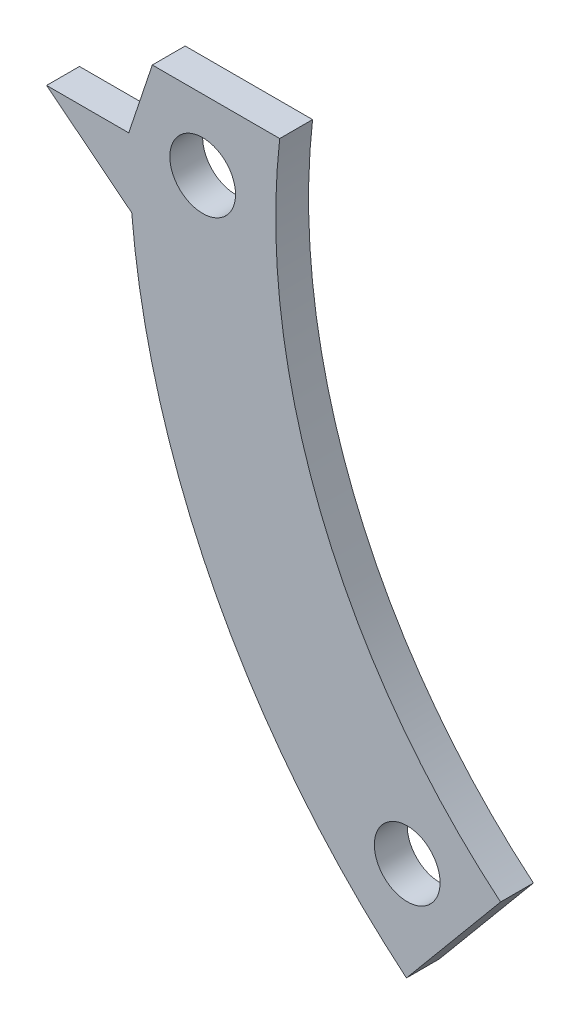
ISO-10303-21;
HEADER;
FILE_DESCRIPTION(('STEP AP214'),'2;1');
FILE_NAME('part.step','',(''),(''),'','','');
FILE_SCHEMA(('AUTOMOTIVE_DESIGN { 1 0 10303 214 1 1 1 1 }'));
ENDSEC;
DATA;
#1=APPLICATION_CONTEXT('core data for automotive mechanical design processes');
#2=APPLICATION_PROTOCOL_DEFINITION('international standard','automotive_design',2000,#1);
#3=PRODUCT_CONTEXT('',#1,'mechanical');
#4=PRODUCT('Part','Part','',(#3));
#5=PRODUCT_RELATED_PRODUCT_CATEGORY('part','',(#4));
#6=PRODUCT_DEFINITION_FORMATION('','',#4);
#7=PRODUCT_DEFINITION_CONTEXT('part definition',#1,'design');
#8=PRODUCT_DEFINITION('design','',#6,#7);
#9=PRODUCT_DEFINITION_SHAPE('','',#8);
#10=(LENGTH_UNIT() NAMED_UNIT(*) SI_UNIT(.MILLI.,.METRE.));
#11=(NAMED_UNIT(*) PLANE_ANGLE_UNIT() SI_UNIT($,.RADIAN.));
#12=(NAMED_UNIT(*) SI_UNIT($,.STERADIAN.) SOLID_ANGLE_UNIT());
#13=UNCERTAINTY_MEASURE_WITH_UNIT(LENGTH_MEASURE(1.E-05),#10,'distance_accuracy_value','');
#14=(GEOMETRIC_REPRESENTATION_CONTEXT(3) GLOBAL_UNCERTAINTY_ASSIGNED_CONTEXT((#13)) GLOBAL_UNIT_ASSIGNED_CONTEXT((#10,
#11,#12)) REPRESENTATION_CONTEXT('',''));
#15=CARTESIAN_POINT('',(0.,0.,0.));
#16=DIRECTION('',(0.,0.,1.));
#17=DIRECTION('',(1.,0.,0.));
#18=AXIS2_PLACEMENT_3D('',#15,#16,#17);
#19=CARTESIAN_POINT('',(0.,53.009783314729,2.));
#20=DIRECTION('',(0.,0.,1.));
#21=DIRECTION('',(1.,0.,0.));
#22=AXIS2_PLACEMENT_3D('',#19,#20,#21);
#23=PLANE('',#22);
#24=CARTESIAN_POINT('',(-30.0520382004283,22.9577451143008,2.));
#25=DIRECTION('',(0.,0.,1.));
#26=DIRECTION('',(1.,0.,0.));
#27=AXIS2_PLACEMENT_3D('',#24,#25,#26);
#28=CIRCLE('',#27,2.);
#29=CARTESIAN_POINT('',(-28.0520382004283,22.9577451143008,2.));
#30=VERTEX_POINT('',#29);
#31=EDGE_CURVE('E128',#30,#30,#28,.T.);
#32=ORIENTED_EDGE('',*,*,#31,.F.);
#33=EDGE_LOOP('',(#32));
#34=FACE_BOUND('',#33,.T.);
#35=CARTESIAN_POINT('',(0.,53.009783314729,2.));
#36=DIRECTION('',(0.,0.,-1.));
#37=DIRECTION('',(1.,0.,0.));
#38=AXIS2_PLACEMENT_3D('',#35,#36,#37);
#39=CIRCLE('',#38,38.0547924587685);
#40=CARTESIAN_POINT('',(-24.3706790032404,23.7824462139777,2.));
#41=VERTEX_POINT('',#40);
#42=CARTESIAN_POINT('',(-37.8116954402825,57.3043050589126,2.));
#43=VERTEX_POINT('',#42);
#44=EDGE_CURVE('E137',#41,#43,#39,.T.);
#45=ORIENTED_EDGE('',*,*,#44,.T.);
#46=DIRECTION('',(-1.,0.,0.));
#47=VECTOR('',#46,1.);
#48=CARTESIAN_POINT('',(-37.8116954402825,57.3043050589126,2.));
#49=LINE('',#48,#47);
#50=CARTESIAN_POINT('',(-45.5658100455985,57.3043050589128,2.));
#51=VERTEX_POINT('',#50);
#52=EDGE_CURVE('E90',#43,#51,#49,.T.);
#53=ORIENTED_EDGE('',*,*,#52,.T.);
#54=DIRECTION('',(-0.316760978067004,-0.948505394172345,0.));
#55=VECTOR('',#54,1.);
#56=CARTESIAN_POINT('',(-45.5658100455985,57.3043050589128,2.));
#57=LINE('',#56,#55);
#58=CARTESIAN_POINT('',(-47.,53.009783314729,2.));
#59=VERTEX_POINT('',#58);
#60=EDGE_CURVE('E149',#51,#59,#57,.T.);
#61=ORIENTED_EDGE('',*,*,#60,.T.);
#62=DIRECTION('',(-1.,0.,0.));
#63=VECTOR('',#62,1.);
#64=CARTESIAN_POINT('',(-47.,53.009783314729,2.));
#65=LINE('',#64,#63);
#66=CARTESIAN_POINT('',(-52.,53.0097833147292,2.));
#67=VERTEX_POINT('',#66);
#68=EDGE_CURVE('E106',#59,#67,#65,.T.);
#69=ORIENTED_EDGE('',*,*,#68,.T.);
#70=DIRECTION('',(0.782840450380728,-0.622222491756525,0.));
#71=VECTOR('',#70,1.);
#72=CARTESIAN_POINT('',(-52.,53.0097833147292,2.));
#73=LINE('',#72,#71);
#74=CARTESIAN_POINT('',(-46.8192679758283,48.8919991766775,2.));
#75=VERTEX_POINT('',#74);
#76=EDGE_CURVE('E100',#67,#75,#73,.T.);
#77=ORIENTED_EDGE('',*,*,#76,.T.);
#78=CARTESIAN_POINT('',(0.,53.009783314729,2.));
#79=DIRECTION('',(0.,0.,1.));
#80=DIRECTION('',(-1.,0.,0.));
#81=AXIS2_PLACEMENT_3D('',#78,#79,#80);
#82=CIRCLE('',#81,47.);
#83=CARTESIAN_POINT('',(-30.0992815660035,16.9122314696185,2.));
#84=VERTEX_POINT('',#83);
#85=EDGE_CURVE('E104',#75,#84,#82,.T.);
#86=ORIENTED_EDGE('',*,*,#85,.T.);
#87=DIRECTION('',(0.640410246085178,0.768033017981077,0.));
#88=VECTOR('',#87,1.);
#89=CARTESIAN_POINT('',(-24.3706790032404,23.7824462139777,2.));
#90=LINE('',#89,#88);
#91=EDGE_CURVE('E50',#84,#41,#90,.T.);
#92=ORIENTED_EDGE('',*,*,#91,.T.);
#93=EDGE_LOOP('',(#45,#53,#61,#69,#77,#86,#92));
#94=FACE_BOUND('',#93,.T.);
#95=CARTESIAN_POINT('',(-42.5,53.0097833147292,2.));
#96=DIRECTION('',(0.,0.,1.));
#97=DIRECTION('',(1.,0.,0.));
#98=AXIS2_PLACEMENT_3D('',#95,#96,#97);
#99=CIRCLE('',#98,2.);
#100=CARTESIAN_POINT('',(-40.5,53.0097833147292,2.));
#101=VERTEX_POINT('',#100);
#102=EDGE_CURVE('E164',#101,#101,#99,.T.);
#103=ORIENTED_EDGE('',*,*,#102,.F.);
#104=EDGE_LOOP('',(#103));
#105=FACE_BOUND('',#104,.T.);
#106=ADVANCED_FACE('F33',(#34,#94,#105),#23,.T.);
#107=CARTESIAN_POINT('',(0.,53.009783314729,0.));
#108=DIRECTION('',(0.,0.,1.));
#109=DIRECTION('',(1.,0.,0.));
#110=AXIS2_PLACEMENT_3D('',#107,#108,#109);
#111=PLANE('',#110);
#112=CARTESIAN_POINT('',(0.,53.009783314729,0.));
#113=DIRECTION('',(0.,0.,-1.));
#114=DIRECTION('',(1.,0.,0.));
#115=AXIS2_PLACEMENT_3D('',#112,#113,#114);
#116=CIRCLE('',#115,38.0547924587685);
#117=CARTESIAN_POINT('',(-24.3706790032404,23.7824462139777,0.));
#118=VERTEX_POINT('',#117);
#119=CARTESIAN_POINT('',(-37.8116954402825,57.3043050589126,0.));
#120=VERTEX_POINT('',#119);
#121=EDGE_CURVE('E124',#118,#120,#116,.T.);
#122=ORIENTED_EDGE('',*,*,#121,.F.);
#123=DIRECTION('',(0.640410246085178,0.768033017981077,0.));
#124=VECTOR('',#123,1.);
#125=CARTESIAN_POINT('',(-24.3706790032404,23.7824462139777,0.));
#126=LINE('',#125,#124);
#127=CARTESIAN_POINT('',(-30.0992815660035,16.9122314696185,0.));
#128=VERTEX_POINT('',#127);
#129=EDGE_CURVE('E82',#128,#118,#126,.T.);
#130=ORIENTED_EDGE('',*,*,#129,.F.);
#131=CARTESIAN_POINT('',(0.,53.009783314729,0.));
#132=DIRECTION('',(0.,0.,1.));
#133=DIRECTION('',(-1.,0.,0.));
#134=AXIS2_PLACEMENT_3D('',#131,#132,#133);
#135=CIRCLE('',#134,47.);
#136=CARTESIAN_POINT('',(-46.8192679758283,48.8919991766775,0.));
#137=VERTEX_POINT('',#136);
#138=EDGE_CURVE('E76',#137,#128,#135,.T.);
#139=ORIENTED_EDGE('',*,*,#138,.F.);
#140=DIRECTION('',(0.782840450380728,-0.622222491756525,0.));
#141=VECTOR('',#140,1.);
#142=CARTESIAN_POINT('',(-52.,53.0097833147292,0.));
#143=LINE('',#142,#141);
#144=CARTESIAN_POINT('',(-52.,53.0097833147292,0.));
#145=VERTEX_POINT('',#144);
#146=EDGE_CURVE('E114',#145,#137,#143,.T.);
#147=ORIENTED_EDGE('',*,*,#146,.F.);
#148=DIRECTION('',(-1.,0.,0.));
#149=VECTOR('',#148,1.);
#150=CARTESIAN_POINT('',(-47.,53.009783314729,0.));
#151=LINE('',#150,#149);
#152=CARTESIAN_POINT('',(-47.,53.009783314729,0.));
#153=VERTEX_POINT('',#152);
#154=EDGE_CURVE('E132',#153,#145,#151,.T.);
#155=ORIENTED_EDGE('',*,*,#154,.F.);
#156=DIRECTION('',(-0.316760978067004,-0.948505394172345,0.));
#157=VECTOR('',#156,1.);
#158=CARTESIAN_POINT('',(-45.5658100455985,57.3043050589128,0.));
#159=LINE('',#158,#157);
#160=CARTESIAN_POINT('',(-45.5658100455985,57.3043050589128,0.));
#161=VERTEX_POINT('',#160);
#162=EDGE_CURVE('E130',#161,#153,#159,.T.);
#163=ORIENTED_EDGE('',*,*,#162,.F.);
#164=DIRECTION('',(-1.,0.,0.));
#165=VECTOR('',#164,1.);
#166=CARTESIAN_POINT('',(-37.8116954402825,57.3043050589126,0.));
#167=LINE('',#166,#165);
#168=EDGE_CURVE('E127',#120,#161,#167,.T.);
#169=ORIENTED_EDGE('',*,*,#168,.F.);
#170=EDGE_LOOP('',(#122,#130,#139,#147,#155,#163,#169));
#171=FACE_BOUND('',#170,.T.);
#172=CARTESIAN_POINT('',(-30.0520382004283,22.9577451143008,0.));
#173=DIRECTION('',(0.,0.,1.));
#174=DIRECTION('',(1.,0.,0.));
#175=AXIS2_PLACEMENT_3D('',#172,#173,#174);
#176=CIRCLE('',#175,2.);
#177=CARTESIAN_POINT('',(-28.0520382004283,22.9577451143008,0.));
#178=VERTEX_POINT('',#177);
#179=EDGE_CURVE('E161',#178,#178,#176,.T.);
#180=ORIENTED_EDGE('',*,*,#179,.T.);
#181=EDGE_LOOP('',(#180));
#182=FACE_BOUND('',#181,.T.);
#183=CARTESIAN_POINT('',(-42.5,53.0097833147292,0.));
#184=DIRECTION('',(0.,0.,1.));
#185=DIRECTION('',(1.,0.,0.));
#186=AXIS2_PLACEMENT_3D('',#183,#184,#185);
#187=CIRCLE('',#186,2.);
#188=CARTESIAN_POINT('',(-40.5,53.0097833147292,0.));
#189=VERTEX_POINT('',#188);
#190=EDGE_CURVE('E167',#189,#189,#187,.T.);
#191=ORIENTED_EDGE('',*,*,#190,.T.);
#192=EDGE_LOOP('',(#191));
#193=FACE_BOUND('',#192,.T.);
#194=ADVANCED_FACE('F153',(#171,#182,#193),#111,.F.);
#195=CARTESIAN_POINT('',(0.,53.009783314729,2.));
#196=DIRECTION('',(0.,0.,-1.));
#197=DIRECTION('',(-1.,0.,0.));
#198=AXIS2_PLACEMENT_3D('',#195,#196,#197);
#199=CYLINDRICAL_SURFACE('',#198,38.0547924587685);
#200=ORIENTED_EDGE('',*,*,#121,.T.);
#201=DIRECTION('',(0.,0.,-1.));
#202=VECTOR('',#201,1.);
#203=CARTESIAN_POINT('',(-37.8116954402825,57.3043050589126,2.));
#204=LINE('',#203,#202);
#205=EDGE_CURVE('E11',#43,#120,#204,.T.);
#206=ORIENTED_EDGE('',*,*,#205,.F.);
#207=ORIENTED_EDGE('',*,*,#44,.F.);
#208=DIRECTION('',(0.,0.,-1.));
#209=VECTOR('',#208,1.);
#210=CARTESIAN_POINT('',(-24.3706790032404,23.7824462139777,2.));
#211=LINE('',#210,#209);
#212=EDGE_CURVE('E120',#41,#118,#211,.T.);
#213=ORIENTED_EDGE('',*,*,#212,.T.);
#214=EDGE_LOOP('',(#200,#206,#207,#213));
#215=FACE_BOUND('',#214,.T.);
#216=ADVANCED_FACE('F35',(#215),#199,.F.);
#217=CARTESIAN_POINT('',(-37.8116954402825,57.3043050589126,2.));
#218=DIRECTION('',(0.,-1.,0.));
#219=DIRECTION('',(1.,0.,0.));
#220=AXIS2_PLACEMENT_3D('',#217,#218,#219);
#221=PLANE('',#220);
#222=ORIENTED_EDGE('',*,*,#168,.T.);
#223=DIRECTION('',(0.,0.,-1.));
#224=VECTOR('',#223,1.);
#225=CARTESIAN_POINT('',(-45.5658100455985,57.3043050589128,2.));
#226=LINE('',#225,#224);
#227=EDGE_CURVE('E42',#51,#161,#226,.T.);
#228=ORIENTED_EDGE('',*,*,#227,.F.);
#229=ORIENTED_EDGE('',*,*,#52,.F.);
#230=ORIENTED_EDGE('',*,*,#205,.T.);
#231=EDGE_LOOP('',(#222,#228,#229,#230));
#232=FACE_BOUND('',#231,.T.);
#233=ADVANCED_FACE('F197',(#232),#221,.F.);
#234=CARTESIAN_POINT('',(-45.5658100455985,57.3043050589128,2.));
#235=DIRECTION('',(0.948505394172345,-0.316760978067004,0.));
#236=DIRECTION('',(0.316760978067004,0.948505394172345,0.));
#237=AXIS2_PLACEMENT_3D('',#234,#235,#236);
#238=PLANE('',#237);
#239=ORIENTED_EDGE('',*,*,#162,.T.);
#240=DIRECTION('',(0.,0.,-1.));
#241=VECTOR('',#240,1.);
#242=CARTESIAN_POINT('',(-47.,53.009783314729,2.));
#243=LINE('',#242,#241);
#244=EDGE_CURVE('E141',#59,#153,#243,.T.);
#245=ORIENTED_EDGE('',*,*,#244,.F.);
#246=ORIENTED_EDGE('',*,*,#60,.F.);
#247=ORIENTED_EDGE('',*,*,#227,.T.);
#248=EDGE_LOOP('',(#239,#245,#246,#247));
#249=FACE_BOUND('',#248,.T.);
#250=ADVANCED_FACE('F147',(#249),#238,.F.);
#251=CARTESIAN_POINT('',(-47.,53.009783314729,2.));
#252=DIRECTION('',(0.,-1.,0.));
#253=DIRECTION('',(1.,0.,0.));
#254=AXIS2_PLACEMENT_3D('',#251,#252,#253);
#255=PLANE('',#254);
#256=ORIENTED_EDGE('',*,*,#154,.T.);
#257=DIRECTION('',(0.,0.,-1.));
#258=VECTOR('',#257,1.);
#259=CARTESIAN_POINT('',(-52.,53.0097833147292,2.));
#260=LINE('',#259,#258);
#261=EDGE_CURVE('E115',#67,#145,#260,.T.);
#262=ORIENTED_EDGE('',*,*,#261,.F.);
#263=ORIENTED_EDGE('',*,*,#68,.F.);
#264=ORIENTED_EDGE('',*,*,#244,.T.);
#265=EDGE_LOOP('',(#256,#262,#263,#264));
#266=FACE_BOUND('',#265,.T.);
#267=ADVANCED_FACE('F156',(#266),#255,.F.);
#268=CARTESIAN_POINT('',(-52.,53.0097833147292,2.));
#269=DIRECTION('',(0.622222491756525,0.782840450380728,0.));
#270=DIRECTION('',(-0.782840450380728,0.622222491756525,0.));
#271=AXIS2_PLACEMENT_3D('',#268,#269,#270);
#272=PLANE('',#271);
#273=ORIENTED_EDGE('',*,*,#146,.T.);
#274=DIRECTION('',(0.,0.,-1.));
#275=VECTOR('',#274,1.);
#276=CARTESIAN_POINT('',(-46.8192679758283,48.8919991766775,2.));
#277=LINE('',#276,#275);
#278=EDGE_CURVE('E111',#75,#137,#277,.T.);
#279=ORIENTED_EDGE('',*,*,#278,.F.);
#280=ORIENTED_EDGE('',*,*,#76,.F.);
#281=ORIENTED_EDGE('',*,*,#261,.T.);
#282=EDGE_LOOP('',(#273,#279,#280,#281));
#283=FACE_BOUND('',#282,.T.);
#284=ADVANCED_FACE('F112',(#283),#272,.F.);
#285=CARTESIAN_POINT('',(0.,53.009783314729,2.));
#286=DIRECTION('',(0.,0.,-1.));
#287=DIRECTION('',(-1.,0.,0.));
#288=AXIS2_PLACEMENT_3D('',#285,#286,#287);
#289=CYLINDRICAL_SURFACE('',#288,47.);
#290=ORIENTED_EDGE('',*,*,#138,.T.);
#291=DIRECTION('',(0.,0.,-1.));
#292=VECTOR('',#291,1.);
#293=CARTESIAN_POINT('',(-30.0992815660035,16.9122314696185,2.));
#294=LINE('',#293,#292);
#295=EDGE_CURVE('E116',#84,#128,#294,.T.);
#296=ORIENTED_EDGE('',*,*,#295,.F.);
#297=ORIENTED_EDGE('',*,*,#85,.F.);
#298=ORIENTED_EDGE('',*,*,#278,.T.);
#299=EDGE_LOOP('',(#290,#296,#297,#298));
#300=FACE_BOUND('',#299,.T.);
#301=ADVANCED_FACE('F118',(#300),#289,.T.);
#302=CARTESIAN_POINT('',(-24.3706790032404,23.7824462139777,2.));
#303=DIRECTION('',(-0.768033017981077,0.640410246085178,0.));
#304=DIRECTION('',(-0.640410246085178,-0.768033017981077,0.));
#305=AXIS2_PLACEMENT_3D('',#302,#303,#304);
#306=PLANE('',#305);
#307=ORIENTED_EDGE('',*,*,#129,.T.);
#308=ORIENTED_EDGE('',*,*,#212,.F.);
#309=ORIENTED_EDGE('',*,*,#91,.F.);
#310=ORIENTED_EDGE('',*,*,#295,.T.);
#311=EDGE_LOOP('',(#307,#308,#309,#310));
#312=FACE_BOUND('',#311,.T.);
#313=ADVANCED_FACE('F187',(#312),#306,.F.);
#314=CARTESIAN_POINT('',(-30.0520382004283,22.9577451143008,2.));
#315=DIRECTION('',(0.,0.,-1.));
#316=DIRECTION('',(-1.,0.,0.));
#317=AXIS2_PLACEMENT_3D('',#314,#315,#316);
#318=CYLINDRICAL_SURFACE('',#317,2.);
#319=ORIENTED_EDGE('',*,*,#31,.T.);
#320=EDGE_LOOP('',(#319));
#321=FACE_BOUND('',#320,.T.);
#322=ORIENTED_EDGE('',*,*,#179,.F.);
#323=EDGE_LOOP('',(#322));
#324=FACE_BOUND('',#323,.T.);
#325=ADVANCED_FACE('F184',(#321,#324),#318,.F.);
#326=CARTESIAN_POINT('',(-42.5,53.0097833147292,2.));
#327=DIRECTION('',(0.,0.,-1.));
#328=DIRECTION('',(-1.,0.,0.));
#329=AXIS2_PLACEMENT_3D('',#326,#327,#328);
#330=CYLINDRICAL_SURFACE('',#329,2.);
#331=ORIENTED_EDGE('',*,*,#102,.T.);
#332=EDGE_LOOP('',(#331));
#333=FACE_BOUND('',#332,.T.);
#334=ORIENTED_EDGE('',*,*,#190,.F.);
#335=EDGE_LOOP('',(#334));
#336=FACE_BOUND('',#335,.T.);
#337=ADVANCED_FACE('F173',(#333,#336),#330,.F.);
#338=CLOSED_SHELL('',(#106,#194,#216,#233,#250,#267,#284,#301,#313,#325,#337));
#339=MANIFOLD_SOLID_BREP('B2',#338);
#340=ADVANCED_BREP_SHAPE_REPRESENTATION('',(#18,#339),#14);
#341=SHAPE_DEFINITION_REPRESENTATION(#9,#340);
ENDSEC;
END-ISO-10303-21;
